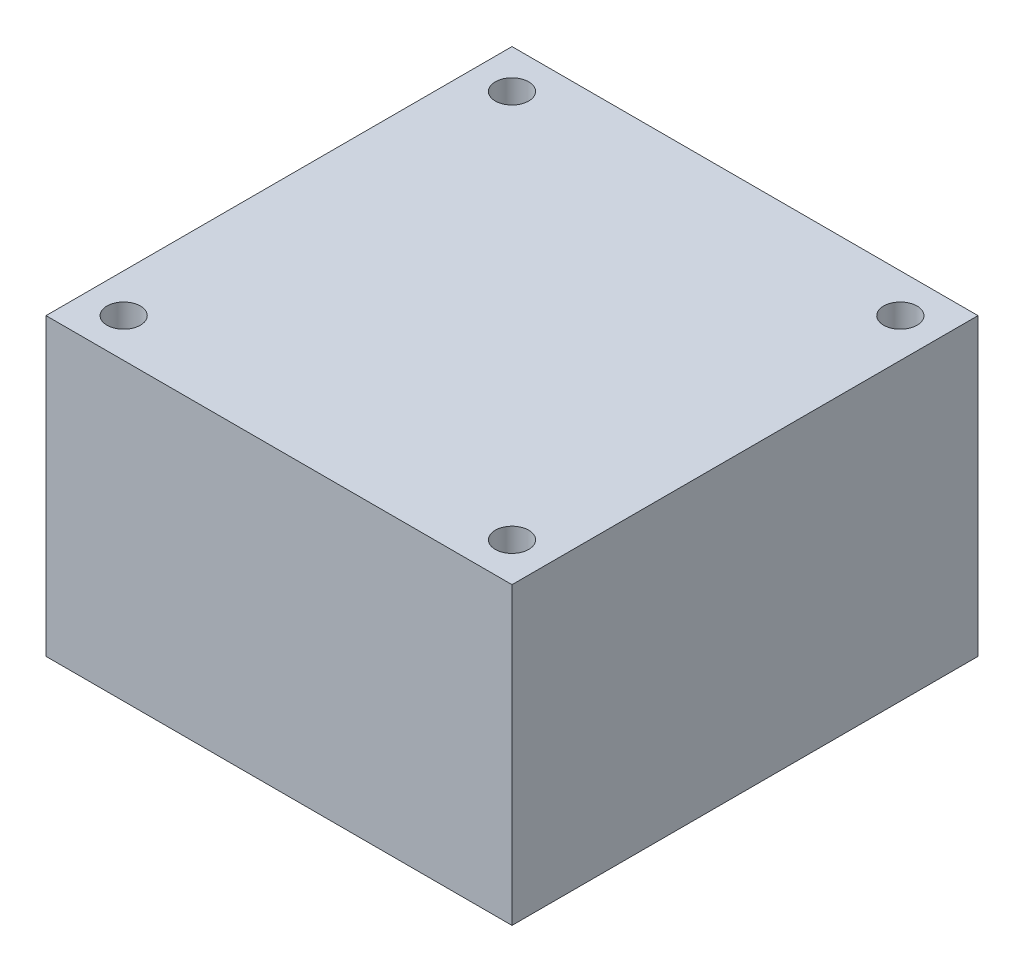
ISO-10303-21;
HEADER;
FILE_DESCRIPTION(('STEP AP214'),'2;1');
FILE_NAME('part.step','',(''),(''),'','','');
FILE_SCHEMA(('AUTOMOTIVE_DESIGN { 1 0 10303 214 1 1 1 1 }'));
ENDSEC;
DATA;
#1=APPLICATION_CONTEXT('core data for automotive mechanical design processes');
#2=APPLICATION_PROTOCOL_DEFINITION('international standard','automotive_design',2000,#1);
#3=PRODUCT_CONTEXT('',#1,'mechanical');
#4=PRODUCT('Part','Part','',(#3));
#5=PRODUCT_RELATED_PRODUCT_CATEGORY('part','',(#4));
#6=PRODUCT_DEFINITION_FORMATION('','',#4);
#7=PRODUCT_DEFINITION_CONTEXT('part definition',#1,'design');
#8=PRODUCT_DEFINITION('design','',#6,#7);
#9=PRODUCT_DEFINITION_SHAPE('','',#8);
#10=(LENGTH_UNIT() NAMED_UNIT(*) SI_UNIT(.MILLI.,.METRE.));
#11=(NAMED_UNIT(*) PLANE_ANGLE_UNIT() SI_UNIT($,.RADIAN.));
#12=(NAMED_UNIT(*) SI_UNIT($,.STERADIAN.) SOLID_ANGLE_UNIT());
#13=UNCERTAINTY_MEASURE_WITH_UNIT(LENGTH_MEASURE(1.E-05),#10,'distance_accuracy_value','');
#14=(GEOMETRIC_REPRESENTATION_CONTEXT(3) GLOBAL_UNCERTAINTY_ASSIGNED_CONTEXT((#13)) GLOBAL_UNIT_ASSIGNED_CONTEXT((#10,
#11,#12)) REPRESENTATION_CONTEXT('',''));
#15=CARTESIAN_POINT('',(0.,0.,0.));
#16=DIRECTION('',(0.,0.,1.));
#17=DIRECTION('',(1.,0.,0.));
#18=AXIS2_PLACEMENT_3D('',#15,#16,#17);
#19=CARTESIAN_POINT('',(0.,38.,0.));
#20=DIRECTION('',(1.,0.,0.));
#21=DIRECTION('',(0.,0.,-1.));
#22=AXIS2_PLACEMENT_3D('',#19,#20,#21);
#23=PLANE('',#22);
#24=DIRECTION('',(0.,0.,1.));
#25=VECTOR('',#24,1.);
#26=CARTESIAN_POINT('',(0.,0.,0.));
#27=LINE('',#26,#25);
#28=CARTESIAN_POINT('',(0.,0.,-60.));
#29=VERTEX_POINT('',#28);
#30=CARTESIAN_POINT('',(0.,0.,0.));
#31=VERTEX_POINT('',#30);
#32=EDGE_CURVE('E95',#29,#31,#27,.T.);
#33=ORIENTED_EDGE('',*,*,#32,.T.);
#34=DIRECTION('',(0.,-1.,0.));
#35=VECTOR('',#34,1.);
#36=CARTESIAN_POINT('',(0.,38.,0.));
#37=LINE('',#36,#35);
#38=CARTESIAN_POINT('',(0.,38.,0.));
#39=VERTEX_POINT('',#38);
#40=EDGE_CURVE('E11',#39,#31,#37,.T.);
#41=ORIENTED_EDGE('',*,*,#40,.F.);
#42=DIRECTION('',(0.,0.,1.));
#43=VECTOR('',#42,1.);
#44=CARTESIAN_POINT('',(0.,38.,0.));
#45=LINE('',#44,#43);
#46=CARTESIAN_POINT('',(0.,38.,-60.));
#47=VERTEX_POINT('',#46);
#48=EDGE_CURVE('E83',#47,#39,#45,.T.);
#49=ORIENTED_EDGE('',*,*,#48,.F.);
#50=DIRECTION('',(0.,-1.,0.));
#51=VECTOR('',#50,1.);
#52=CARTESIAN_POINT('',(0.,38.,-60.));
#53=LINE('',#52,#51);
#54=EDGE_CURVE('E91',#47,#29,#53,.T.);
#55=ORIENTED_EDGE('',*,*,#54,.T.);
#56=EDGE_LOOP('',(#33,#41,#49,#55));
#57=FACE_BOUND('',#56,.T.);
#58=ADVANCED_FACE('F32',(#57),#23,.F.);
#59=CARTESIAN_POINT('',(0.,38.,0.));
#60=DIRECTION('',(0.,0.,-1.));
#61=DIRECTION('',(-1.,0.,0.));
#62=AXIS2_PLACEMENT_3D('',#59,#60,#61);
#63=PLANE('',#62);
#64=DIRECTION('',(1.,0.,0.));
#65=VECTOR('',#64,1.);
#66=CARTESIAN_POINT('',(0.,0.,0.));
#67=LINE('',#66,#65);
#68=CARTESIAN_POINT('',(60.,0.,0.));
#69=VERTEX_POINT('',#68);
#70=EDGE_CURVE('E87',#31,#69,#67,.T.);
#71=ORIENTED_EDGE('',*,*,#70,.T.);
#72=DIRECTION('',(0.,-1.,0.));
#73=VECTOR('',#72,1.);
#74=CARTESIAN_POINT('',(60.,38.,0.));
#75=LINE('',#74,#73);
#76=CARTESIAN_POINT('',(60.,38.,0.));
#77=VERTEX_POINT('',#76);
#78=EDGE_CURVE('E40',#77,#69,#75,.T.);
#79=ORIENTED_EDGE('',*,*,#78,.F.);
#80=DIRECTION('',(1.,0.,0.));
#81=VECTOR('',#80,1.);
#82=CARTESIAN_POINT('',(0.,38.,0.));
#83=LINE('',#82,#81);
#84=EDGE_CURVE('E78',#39,#77,#83,.T.);
#85=ORIENTED_EDGE('',*,*,#84,.F.);
#86=ORIENTED_EDGE('',*,*,#40,.T.);
#87=EDGE_LOOP('',(#71,#79,#85,#86));
#88=FACE_BOUND('',#87,.T.);
#89=ADVANCED_FACE('F86',(#88),#63,.F.);
#90=CARTESIAN_POINT('',(60.,38.,0.));
#91=DIRECTION('',(-1.,0.,0.));
#92=DIRECTION('',(0.,0.,1.));
#93=AXIS2_PLACEMENT_3D('',#90,#91,#92);
#94=PLANE('',#93);
#95=DIRECTION('',(0.,0.,-1.));
#96=VECTOR('',#95,1.);
#97=CARTESIAN_POINT('',(60.,0.,0.));
#98=LINE('',#97,#96);
#99=CARTESIAN_POINT('',(60.,0.,-60.));
#100=VERTEX_POINT('',#99);
#101=EDGE_CURVE('E65',#69,#100,#98,.T.);
#102=ORIENTED_EDGE('',*,*,#101,.T.);
#103=DIRECTION('',(0.,-1.,0.));
#104=VECTOR('',#103,1.);
#105=CARTESIAN_POINT('',(60.,38.,-60.));
#106=LINE('',#105,#104);
#107=CARTESIAN_POINT('',(60.,38.,-60.));
#108=VERTEX_POINT('',#107);
#109=EDGE_CURVE('E88',#108,#100,#106,.T.);
#110=ORIENTED_EDGE('',*,*,#109,.F.);
#111=DIRECTION('',(0.,0.,-1.));
#112=VECTOR('',#111,1.);
#113=CARTESIAN_POINT('',(60.,38.,0.));
#114=LINE('',#113,#112);
#115=EDGE_CURVE('E81',#77,#108,#114,.T.);
#116=ORIENTED_EDGE('',*,*,#115,.F.);
#117=ORIENTED_EDGE('',*,*,#78,.T.);
#118=EDGE_LOOP('',(#102,#110,#116,#117));
#119=FACE_BOUND('',#118,.T.);
#120=ADVANCED_FACE('F89',(#119),#94,.F.);
#121=CARTESIAN_POINT('',(0.,38.,-60.));
#122=DIRECTION('',(0.,0.,1.));
#123=DIRECTION('',(1.,0.,0.));
#124=AXIS2_PLACEMENT_3D('',#121,#122,#123);
#125=PLANE('',#124);
#126=DIRECTION('',(-1.,0.,0.));
#127=VECTOR('',#126,1.);
#128=CARTESIAN_POINT('',(0.,0.,-60.));
#129=LINE('',#128,#127);
#130=EDGE_CURVE('E71',#100,#29,#129,.T.);
#131=ORIENTED_EDGE('',*,*,#130,.T.);
#132=ORIENTED_EDGE('',*,*,#54,.F.);
#133=DIRECTION('',(-1.,0.,0.));
#134=VECTOR('',#133,1.);
#135=CARTESIAN_POINT('',(0.,38.,-60.));
#136=LINE('',#135,#134);
#137=EDGE_CURVE('E48',#108,#47,#136,.T.);
#138=ORIENTED_EDGE('',*,*,#137,.F.);
#139=ORIENTED_EDGE('',*,*,#109,.T.);
#140=EDGE_LOOP('',(#131,#132,#138,#139));
#141=FACE_BOUND('',#140,.T.);
#142=ADVANCED_FACE('F103',(#141),#125,.F.);
#143=CARTESIAN_POINT('',(0.,38.,-60.));
#144=DIRECTION('',(0.,-1.,0.));
#145=DIRECTION('',(0.,0.,-1.));
#146=AXIS2_PLACEMENT_3D('',#143,#144,#145);
#147=PLANE('',#146);
#148=CARTESIAN_POINT('',(55.,38.,-5.));
#149=DIRECTION('',(0.,1.,0.));
#150=DIRECTION('',(0.,0.,1.));
#151=AXIS2_PLACEMENT_3D('',#148,#149,#150);
#152=CIRCLE('',#151,2.15);
#153=CARTESIAN_POINT('',(55.,38.,-2.85));
#154=VERTEX_POINT('',#153);
#155=EDGE_CURVE('E127',#154,#154,#152,.T.);
#156=ORIENTED_EDGE('',*,*,#155,.F.);
#157=EDGE_LOOP('',(#156));
#158=FACE_BOUND('',#157,.T.);
#159=CARTESIAN_POINT('',(55.,38.,-55.));
#160=DIRECTION('',(0.,1.,0.));
#161=DIRECTION('',(0.,0.,1.));
#162=AXIS2_PLACEMENT_3D('',#159,#160,#161);
#163=CIRCLE('',#162,2.15);
#164=CARTESIAN_POINT('',(55.,38.,-52.85));
#165=VERTEX_POINT('',#164);
#166=EDGE_CURVE('E121',#165,#165,#163,.T.);
#167=ORIENTED_EDGE('',*,*,#166,.F.);
#168=EDGE_LOOP('',(#167));
#169=FACE_BOUND('',#168,.T.);
#170=CARTESIAN_POINT('',(5.,38.,-55.));
#171=DIRECTION('',(0.,1.,0.));
#172=DIRECTION('',(0.,0.,1.));
#173=AXIS2_PLACEMENT_3D('',#170,#171,#172);
#174=CIRCLE('',#173,2.15);
#175=CARTESIAN_POINT('',(5.,38.,-52.85));
#176=VERTEX_POINT('',#175);
#177=EDGE_CURVE('E115',#176,#176,#174,.T.);
#178=ORIENTED_EDGE('',*,*,#177,.F.);
#179=EDGE_LOOP('',(#178));
#180=FACE_BOUND('',#179,.T.);
#181=CARTESIAN_POINT('',(5.,38.,-5.));
#182=DIRECTION('',(0.,1.,0.));
#183=DIRECTION('',(0.,0.,1.));
#184=AXIS2_PLACEMENT_3D('',#181,#182,#183);
#185=CIRCLE('',#184,2.15);
#186=CARTESIAN_POINT('',(5.,38.,-2.85));
#187=VERTEX_POINT('',#186);
#188=EDGE_CURVE('E109',#187,#187,#185,.T.);
#189=ORIENTED_EDGE('',*,*,#188,.F.);
#190=EDGE_LOOP('',(#189));
#191=FACE_BOUND('',#190,.T.);
#192=ORIENTED_EDGE('',*,*,#48,.T.);
#193=ORIENTED_EDGE('',*,*,#84,.T.);
#194=ORIENTED_EDGE('',*,*,#115,.T.);
#195=ORIENTED_EDGE('',*,*,#137,.T.);
#196=EDGE_LOOP('',(#192,#193,#194,#195));
#197=FACE_BOUND('',#196,.T.);
#198=ADVANCED_FACE('F79',(#158,#169,#180,#191,#197),#147,.F.);
#199=CARTESIAN_POINT('',(0.,0.,-60.));
#200=DIRECTION('',(0.,-1.,0.));
#201=DIRECTION('',(0.,0.,-1.));
#202=AXIS2_PLACEMENT_3D('',#199,#200,#201);
#203=PLANE('',#202);
#204=CARTESIAN_POINT('',(55.,0.,-5.));
#205=DIRECTION('',(0.,1.,0.));
#206=DIRECTION('',(0.,0.,1.));
#207=AXIS2_PLACEMENT_3D('',#204,#205,#206);
#208=CIRCLE('',#207,2.15);
#209=CARTESIAN_POINT('',(55.,0.,-2.85));
#210=VERTEX_POINT('',#209);
#211=EDGE_CURVE('E124',#210,#210,#208,.T.);
#212=ORIENTED_EDGE('',*,*,#211,.T.);
#213=EDGE_LOOP('',(#212));
#214=FACE_BOUND('',#213,.T.);
#215=CARTESIAN_POINT('',(55.,0.,-55.));
#216=DIRECTION('',(0.,1.,0.));
#217=DIRECTION('',(0.,0.,1.));
#218=AXIS2_PLACEMENT_3D('',#215,#216,#217);
#219=CIRCLE('',#218,2.15);
#220=CARTESIAN_POINT('',(55.,0.,-52.85));
#221=VERTEX_POINT('',#220);
#222=EDGE_CURVE('E118',#221,#221,#219,.T.);
#223=ORIENTED_EDGE('',*,*,#222,.T.);
#224=EDGE_LOOP('',(#223));
#225=FACE_BOUND('',#224,.T.);
#226=CARTESIAN_POINT('',(5.,0.,-55.));
#227=DIRECTION('',(0.,1.,0.));
#228=DIRECTION('',(0.,0.,1.));
#229=AXIS2_PLACEMENT_3D('',#226,#227,#228);
#230=CIRCLE('',#229,2.15);
#231=CARTESIAN_POINT('',(5.,0.,-52.85));
#232=VERTEX_POINT('',#231);
#233=EDGE_CURVE('E112',#232,#232,#230,.T.);
#234=ORIENTED_EDGE('',*,*,#233,.T.);
#235=EDGE_LOOP('',(#234));
#236=FACE_BOUND('',#235,.T.);
#237=CARTESIAN_POINT('',(5.,0.,-5.));
#238=DIRECTION('',(0.,1.,0.));
#239=DIRECTION('',(0.,0.,1.));
#240=AXIS2_PLACEMENT_3D('',#237,#238,#239);
#241=CIRCLE('',#240,2.15);
#242=CARTESIAN_POINT('',(5.,0.,-2.85));
#243=VERTEX_POINT('',#242);
#244=EDGE_CURVE('E98',#243,#243,#241,.T.);
#245=ORIENTED_EDGE('',*,*,#244,.T.);
#246=EDGE_LOOP('',(#245));
#247=FACE_BOUND('',#246,.T.);
#248=ORIENTED_EDGE('',*,*,#32,.F.);
#249=ORIENTED_EDGE('',*,*,#130,.F.);
#250=ORIENTED_EDGE('',*,*,#101,.F.);
#251=ORIENTED_EDGE('',*,*,#70,.F.);
#252=EDGE_LOOP('',(#248,#249,#250,#251));
#253=FACE_BOUND('',#252,.T.);
#254=ADVANCED_FACE('F106',(#214,#225,#236,#247,#253),#203,.T.);
#255=CARTESIAN_POINT('',(5.,0.,-5.));
#256=DIRECTION('',(0.,1.,0.));
#257=DIRECTION('',(0.,0.,1.));
#258=AXIS2_PLACEMENT_3D('',#255,#256,#257);
#259=CYLINDRICAL_SURFACE('',#258,2.15);
#260=ORIENTED_EDGE('',*,*,#244,.F.);
#261=EDGE_LOOP('',(#260));
#262=FACE_BOUND('',#261,.T.);
#263=ORIENTED_EDGE('',*,*,#188,.T.);
#264=EDGE_LOOP('',(#263));
#265=FACE_BOUND('',#264,.T.);
#266=ADVANCED_FACE('F151',(#262,#265),#259,.F.);
#267=CARTESIAN_POINT('',(5.,0.,-55.));
#268=DIRECTION('',(0.,1.,0.));
#269=DIRECTION('',(0.,0.,1.));
#270=AXIS2_PLACEMENT_3D('',#267,#268,#269);
#271=CYLINDRICAL_SURFACE('',#270,2.15);
#272=ORIENTED_EDGE('',*,*,#233,.F.);
#273=EDGE_LOOP('',(#272));
#274=FACE_BOUND('',#273,.T.);
#275=ORIENTED_EDGE('',*,*,#177,.T.);
#276=EDGE_LOOP('',(#275));
#277=FACE_BOUND('',#276,.T.);
#278=ADVANCED_FACE('F153',(#274,#277),#271,.F.);
#279=CARTESIAN_POINT('',(55.,0.,-55.));
#280=DIRECTION('',(0.,1.,0.));
#281=DIRECTION('',(0.,0.,1.));
#282=AXIS2_PLACEMENT_3D('',#279,#280,#281);
#283=CYLINDRICAL_SURFACE('',#282,2.15);
#284=ORIENTED_EDGE('',*,*,#222,.F.);
#285=EDGE_LOOP('',(#284));
#286=FACE_BOUND('',#285,.T.);
#287=ORIENTED_EDGE('',*,*,#166,.T.);
#288=EDGE_LOOP('',(#287));
#289=FACE_BOUND('',#288,.T.);
#290=ADVANCED_FACE('F138',(#286,#289),#283,.F.);
#291=CARTESIAN_POINT('',(55.,0.,-5.));
#292=DIRECTION('',(0.,1.,0.));
#293=DIRECTION('',(0.,0.,1.));
#294=AXIS2_PLACEMENT_3D('',#291,#292,#293);
#295=CYLINDRICAL_SURFACE('',#294,2.15);
#296=ORIENTED_EDGE('',*,*,#211,.F.);
#297=EDGE_LOOP('',(#296));
#298=FACE_BOUND('',#297,.T.);
#299=ORIENTED_EDGE('',*,*,#155,.T.);
#300=EDGE_LOOP('',(#299));
#301=FACE_BOUND('',#300,.T.);
#302=ADVANCED_FACE('F135',(#298,#301),#295,.F.);
#303=CLOSED_SHELL('',(#58,#89,#120,#142,#198,#254,#266,#278,#290,#302));
#304=MANIFOLD_SOLID_BREP('B2',#303);
#305=ADVANCED_BREP_SHAPE_REPRESENTATION('',(#18,#304),#14);
#306=SHAPE_DEFINITION_REPRESENTATION(#9,#305);
ENDSEC;
END-ISO-10303-21;
